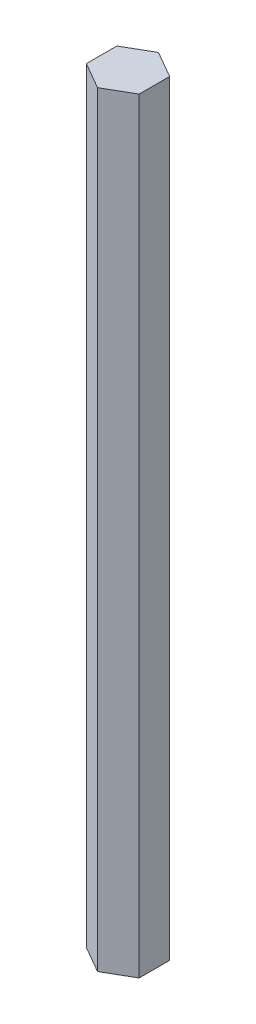
ISO-10303-21;
HEADER;
FILE_DESCRIPTION(('STEP AP214'),'2;1');
FILE_NAME('part.step','',(''),(''),'','','');
FILE_SCHEMA(('AUTOMOTIVE_DESIGN { 1 0 10303 214 1 1 1 1 }'));
ENDSEC;
DATA;
#1=APPLICATION_CONTEXT('core data for automotive mechanical design processes');
#2=APPLICATION_PROTOCOL_DEFINITION('international standard','automotive_design',2000,#1);
#3=PRODUCT_CONTEXT('',#1,'mechanical');
#4=PRODUCT('Part','Part','',(#3));
#5=PRODUCT_RELATED_PRODUCT_CATEGORY('part','',(#4));
#6=PRODUCT_DEFINITION_FORMATION('','',#4);
#7=PRODUCT_DEFINITION_CONTEXT('part definition',#1,'design');
#8=PRODUCT_DEFINITION('design','',#6,#7);
#9=PRODUCT_DEFINITION_SHAPE('','',#8);
#10=(LENGTH_UNIT() NAMED_UNIT(*) SI_UNIT(.MILLI.,.METRE.));
#11=(NAMED_UNIT(*) PLANE_ANGLE_UNIT() SI_UNIT($,.RADIAN.));
#12=(NAMED_UNIT(*) SI_UNIT($,.STERADIAN.) SOLID_ANGLE_UNIT());
#13=UNCERTAINTY_MEASURE_WITH_UNIT(LENGTH_MEASURE(1.E-05),#10,'distance_accuracy_value','');
#14=(GEOMETRIC_REPRESENTATION_CONTEXT(3) GLOBAL_UNCERTAINTY_ASSIGNED_CONTEXT((#13)) GLOBAL_UNIT_ASSIGNED_CONTEXT((#10,
#11,#12)) REPRESENTATION_CONTEXT('',''));
#15=CARTESIAN_POINT('',(0.,0.,0.));
#16=DIRECTION('',(0.,0.,1.));
#17=DIRECTION('',(1.,0.,0.));
#18=AXIS2_PLACEMENT_3D('',#15,#16,#17);
#19=CARTESIAN_POINT('',(6.34999999999995,184.15,-3.6661742093542));
#20=DIRECTION('',(-0.499999999999995,0.,0.866025403784442));
#21=DIRECTION('',(0.866025403784443,0.,0.499999999999995));
#22=AXIS2_PLACEMENT_3D('',#19,#20,#21);
#23=PLANE('',#22);
#24=DIRECTION('',(-0.866025403784443,0.,-0.499999999999995));
#25=VECTOR('',#24,1.);
#26=CARTESIAN_POINT('',(6.34999999999996,0.,-3.6661742093542));
#27=LINE('',#26,#25);
#28=CARTESIAN_POINT('',(6.34999999999996,0.,-3.6661742093542));
#29=VERTEX_POINT('',#28);
#30=CARTESIAN_POINT('',(0.,0.,-7.33234841870824));
#31=VERTEX_POINT('',#30);
#32=EDGE_CURVE('E118',#29,#31,#27,.T.);
#33=ORIENTED_EDGE('',*,*,#32,.T.);
#34=DIRECTION('',(0.,-1.,0.));
#35=VECTOR('',#34,1.);
#36=CARTESIAN_POINT('',(0.,184.15,-7.33234841870824));
#37=LINE('',#36,#35);
#38=CARTESIAN_POINT('',(0.,184.15,-7.33234841870824));
#39=VERTEX_POINT('',#38);
#40=EDGE_CURVE('E11',#39,#31,#37,.T.);
#41=ORIENTED_EDGE('',*,*,#40,.F.);
#42=DIRECTION('',(-0.866025403784443,0.,-0.499999999999995));
#43=VECTOR('',#42,1.);
#44=CARTESIAN_POINT('',(6.34999999999995,184.15,-3.6661742093542));
#45=LINE('',#44,#43);
#46=CARTESIAN_POINT('',(6.34999999999995,184.15,-3.6661742093542));
#47=VERTEX_POINT('',#46);
#48=EDGE_CURVE('E128',#47,#39,#45,.T.);
#49=ORIENTED_EDGE('',*,*,#48,.F.);
#50=DIRECTION('',(0.,-1.,0.));
#51=VECTOR('',#50,1.);
#52=CARTESIAN_POINT('',(6.34999999999995,184.15,-3.6661742093542));
#53=LINE('',#52,#51);
#54=EDGE_CURVE('E114',#47,#29,#53,.T.);
#55=ORIENTED_EDGE('',*,*,#54,.T.);
#56=EDGE_LOOP('',(#33,#41,#49,#55));
#57=FACE_BOUND('',#56,.T.);
#58=ADVANCED_FACE('F34',(#57),#23,.F.);
#59=CARTESIAN_POINT('',(0.,184.15,-7.33234841870824));
#60=DIRECTION('',(0.500000000000002,0.,0.866025403784439));
#61=DIRECTION('',(0.866025403784439,0.,-0.500000000000002));
#62=AXIS2_PLACEMENT_3D('',#59,#60,#61);
#63=PLANE('',#62);
#64=DIRECTION('',(-0.866025403784439,0.,0.500000000000002));
#65=VECTOR('',#64,1.);
#66=CARTESIAN_POINT('',(0.,0.,-7.33234841870824));
#67=LINE('',#66,#65);
#68=CARTESIAN_POINT('',(-6.35,0.,-3.66617420935411));
#69=VERTEX_POINT('',#68);
#70=EDGE_CURVE('E121',#31,#69,#67,.T.);
#71=ORIENTED_EDGE('',*,*,#70,.T.);
#72=DIRECTION('',(0.,-1.,0.));
#73=VECTOR('',#72,1.);
#74=CARTESIAN_POINT('',(-6.35,184.15,-3.66617420935411));
#75=LINE('',#74,#73);
#76=CARTESIAN_POINT('',(-6.35,184.15,-3.66617420935411));
#77=VERTEX_POINT('',#76);
#78=EDGE_CURVE('E42',#77,#69,#75,.T.);
#79=ORIENTED_EDGE('',*,*,#78,.F.);
#80=DIRECTION('',(-0.866025403784439,0.,0.500000000000002));
#81=VECTOR('',#80,1.);
#82=CARTESIAN_POINT('',(0.,184.15,-7.33234841870824));
#83=LINE('',#82,#81);
#84=EDGE_CURVE('E87',#39,#77,#83,.T.);
#85=ORIENTED_EDGE('',*,*,#84,.F.);
#86=ORIENTED_EDGE('',*,*,#40,.T.);
#87=EDGE_LOOP('',(#71,#79,#85,#86));
#88=FACE_BOUND('',#87,.T.);
#89=ADVANCED_FACE('F152',(#88),#63,.F.);
#90=CARTESIAN_POINT('',(-6.35,184.15,-3.66617420935411));
#91=DIRECTION('',(1.,0.,0.));
#92=DIRECTION('',(0.,0.,-1.));
#93=AXIS2_PLACEMENT_3D('',#90,#91,#92);
#94=PLANE('',#93);
#95=DIRECTION('',(0.,0.,1.));
#96=VECTOR('',#95,1.);
#97=CARTESIAN_POINT('',(-6.35,0.,-3.66617420935411));
#98=LINE('',#97,#96);
#99=CARTESIAN_POINT('',(-6.34999999999998,0.,3.66617420935415));
#100=VERTEX_POINT('',#99);
#101=EDGE_CURVE('E123',#69,#100,#98,.T.);
#102=ORIENTED_EDGE('',*,*,#101,.T.);
#103=DIRECTION('',(0.,-1.,0.));
#104=VECTOR('',#103,1.);
#105=CARTESIAN_POINT('',(-6.34999999999998,184.15,3.66617420935415));
#106=LINE('',#105,#104);
#107=CARTESIAN_POINT('',(-6.34999999999998,184.15,3.66617420935415));
#108=VERTEX_POINT('',#107);
#109=EDGE_CURVE('E109',#108,#100,#106,.T.);
#110=ORIENTED_EDGE('',*,*,#109,.F.);
#111=DIRECTION('',(0.,0.,1.));
#112=VECTOR('',#111,1.);
#113=CARTESIAN_POINT('',(-6.35,184.15,-3.66617420935411));
#114=LINE('',#113,#112);
#115=EDGE_CURVE('E100',#77,#108,#114,.T.);
#116=ORIENTED_EDGE('',*,*,#115,.F.);
#117=ORIENTED_EDGE('',*,*,#78,.T.);
#118=EDGE_LOOP('',(#102,#110,#116,#117));
#119=FACE_BOUND('',#118,.T.);
#120=ADVANCED_FACE('F134',(#119),#94,.F.);
#121=CARTESIAN_POINT('',(-6.34999999999998,184.15,3.66617420935415));
#122=DIRECTION('',(0.499999999999995,0.,-0.866025403784442));
#123=DIRECTION('',(-0.866025403784443,0.,-0.499999999999995));
#124=AXIS2_PLACEMENT_3D('',#121,#122,#123);
#125=PLANE('',#124);
#126=DIRECTION('',(0.866025403784443,0.,0.499999999999995));
#127=VECTOR('',#126,1.);
#128=CARTESIAN_POINT('',(-6.34999999999998,0.,3.66617420935415));
#129=LINE('',#128,#127);
#130=CARTESIAN_POINT('',(0.,0.,7.33234841870824));
#131=VERTEX_POINT('',#130);
#132=EDGE_CURVE('E108',#100,#131,#129,.T.);
#133=ORIENTED_EDGE('',*,*,#132,.T.);
#134=DIRECTION('',(0.,-1.,0.));
#135=VECTOR('',#134,1.);
#136=CARTESIAN_POINT('',(0.,184.15,7.33234841870824));
#137=LINE('',#136,#135);
#138=CARTESIAN_POINT('',(0.,184.15,7.33234841870824));
#139=VERTEX_POINT('',#138);
#140=EDGE_CURVE('E105',#139,#131,#137,.T.);
#141=ORIENTED_EDGE('',*,*,#140,.F.);
#142=DIRECTION('',(0.866025403784443,0.,0.499999999999995));
#143=VECTOR('',#142,1.);
#144=CARTESIAN_POINT('',(-6.34999999999998,184.15,3.66617420935415));
#145=LINE('',#144,#143);
#146=EDGE_CURVE('E94',#108,#139,#145,.T.);
#147=ORIENTED_EDGE('',*,*,#146,.F.);
#148=ORIENTED_EDGE('',*,*,#109,.T.);
#149=EDGE_LOOP('',(#133,#141,#147,#148));
#150=FACE_BOUND('',#149,.T.);
#151=ADVANCED_FACE('F106',(#150),#125,.F.);
#152=CARTESIAN_POINT('',(0.,184.15,7.33234841870824));
#153=DIRECTION('',(-0.500000000000008,0.,-0.866025403784435));
#154=DIRECTION('',(-0.866025403784435,0.,0.500000000000007));
#155=AXIS2_PLACEMENT_3D('',#152,#153,#154);
#156=PLANE('',#155);
#157=DIRECTION('',(0.866025403784435,0.,-0.500000000000007));
#158=VECTOR('',#157,1.);
#159=CARTESIAN_POINT('',(0.,0.,7.33234841870824));
#160=LINE('',#159,#158);
#161=CARTESIAN_POINT('',(6.35000000000003,0.,3.66617420935406));
#162=VERTEX_POINT('',#161);
#163=EDGE_CURVE('E73',#131,#162,#160,.T.);
#164=ORIENTED_EDGE('',*,*,#163,.T.);
#165=DIRECTION('',(0.,-1.,0.));
#166=VECTOR('',#165,1.);
#167=CARTESIAN_POINT('',(6.35000000000003,184.15,3.66617420935406));
#168=LINE('',#167,#166);
#169=CARTESIAN_POINT('',(6.35000000000003,184.15,3.66617420935406));
#170=VERTEX_POINT('',#169);
#171=EDGE_CURVE('E110',#170,#162,#168,.T.);
#172=ORIENTED_EDGE('',*,*,#171,.F.);
#173=DIRECTION('',(0.866025403784435,0.,-0.500000000000007));
#174=VECTOR('',#173,1.);
#175=CARTESIAN_POINT('',(0.,184.15,7.33234841870824));
#176=LINE('',#175,#174);
#177=EDGE_CURVE('E98',#139,#170,#176,.T.);
#178=ORIENTED_EDGE('',*,*,#177,.F.);
#179=ORIENTED_EDGE('',*,*,#140,.T.);
#180=EDGE_LOOP('',(#164,#172,#178,#179));
#181=FACE_BOUND('',#180,.T.);
#182=ADVANCED_FACE('F112',(#181),#156,.F.);
#183=CARTESIAN_POINT('',(6.35000000000003,184.15,3.66617420935406));
#184=DIRECTION('',(-1.,0.,0.));
#185=DIRECTION('',(0.,0.,1.));
#186=AXIS2_PLACEMENT_3D('',#183,#184,#185);
#187=PLANE('',#186);
#188=DIRECTION('',(0.,0.,-1.));
#189=VECTOR('',#188,1.);
#190=CARTESIAN_POINT('',(6.35000000000003,0.,3.66617420935406));
#191=LINE('',#190,#189);
#192=EDGE_CURVE('E79',#162,#29,#191,.T.);
#193=ORIENTED_EDGE('',*,*,#192,.T.);
#194=ORIENTED_EDGE('',*,*,#54,.F.);
#195=DIRECTION('',(0.,0.,-1.));
#196=VECTOR('',#195,1.);
#197=CARTESIAN_POINT('',(6.35000000000003,184.15,3.66617420935406));
#198=LINE('',#197,#196);
#199=EDGE_CURVE('E50',#170,#47,#198,.T.);
#200=ORIENTED_EDGE('',*,*,#199,.F.);
#201=ORIENTED_EDGE('',*,*,#171,.T.);
#202=EDGE_LOOP('',(#193,#194,#200,#201));
#203=FACE_BOUND('',#202,.T.);
#204=ADVANCED_FACE('F141',(#203),#187,.F.);
#205=CARTESIAN_POINT('',(0.,184.15,0.));
#206=DIRECTION('',(0.,1.,0.));
#207=DIRECTION('',(0.,0.,1.));
#208=AXIS2_PLACEMENT_3D('',#205,#206,#207);
#209=PLANE('',#208);
#210=ORIENTED_EDGE('',*,*,#48,.T.);
#211=ORIENTED_EDGE('',*,*,#84,.T.);
#212=ORIENTED_EDGE('',*,*,#115,.T.);
#213=ORIENTED_EDGE('',*,*,#146,.T.);
#214=ORIENTED_EDGE('',*,*,#177,.T.);
#215=ORIENTED_EDGE('',*,*,#199,.T.);
#216=EDGE_LOOP('',(#210,#211,#212,#213,#214,#215));
#217=FACE_BOUND('',#216,.T.);
#218=ADVANCED_FACE('F96',(#217),#209,.T.);
#219=CARTESIAN_POINT('',(0.,0.,0.));
#220=DIRECTION('',(0.,1.,0.));
#221=DIRECTION('',(0.,0.,1.));
#222=AXIS2_PLACEMENT_3D('',#219,#220,#221);
#223=PLANE('',#222);
#224=ORIENTED_EDGE('',*,*,#32,.F.);
#225=ORIENTED_EDGE('',*,*,#192,.F.);
#226=ORIENTED_EDGE('',*,*,#163,.F.);
#227=ORIENTED_EDGE('',*,*,#132,.F.);
#228=ORIENTED_EDGE('',*,*,#101,.F.);
#229=ORIENTED_EDGE('',*,*,#70,.F.);
#230=EDGE_LOOP('',(#224,#225,#226,#227,#228,#229));
#231=FACE_BOUND('',#230,.T.);
#232=ADVANCED_FACE('F137',(#231),#223,.F.);
#233=CLOSED_SHELL('',(#58,#89,#120,#151,#182,#204,#218,#232));
#234=MANIFOLD_SOLID_BREP('B2',#233);
#235=ADVANCED_BREP_SHAPE_REPRESENTATION('',(#18,#234),#14);
#236=SHAPE_DEFINITION_REPRESENTATION(#9,#235);
ENDSEC;
END-ISO-10303-21;
